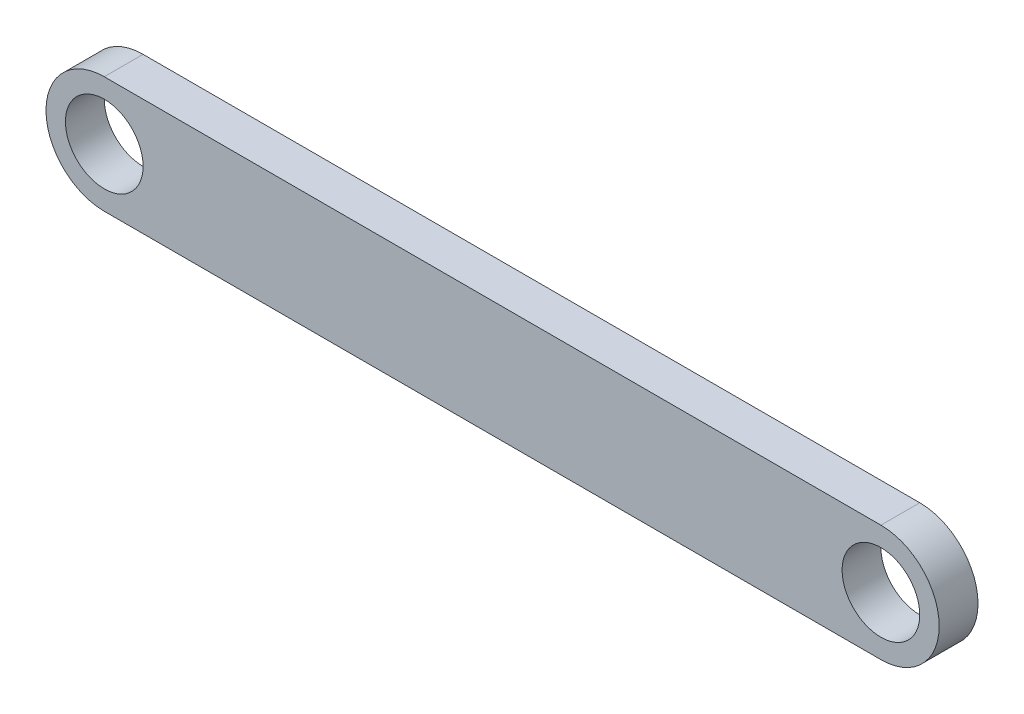
ISO-10303-21;
HEADER;
FILE_DESCRIPTION(('STEP AP214'),'2;1');
FILE_NAME('part.step','',(''),(''),'','','');
FILE_SCHEMA(('AUTOMOTIVE_DESIGN { 1 0 10303 214 1 1 1 1 }'));
ENDSEC;
DATA;
#1=APPLICATION_CONTEXT('core data for automotive mechanical design processes');
#2=APPLICATION_PROTOCOL_DEFINITION('international standard','automotive_design',2000,#1);
#3=PRODUCT_CONTEXT('',#1,'mechanical');
#4=PRODUCT('Part','Part','',(#3));
#5=PRODUCT_RELATED_PRODUCT_CATEGORY('part','',(#4));
#6=PRODUCT_DEFINITION_FORMATION('','',#4);
#7=PRODUCT_DEFINITION_CONTEXT('part definition',#1,'design');
#8=PRODUCT_DEFINITION('design','',#6,#7);
#9=PRODUCT_DEFINITION_SHAPE('','',#8);
#10=(LENGTH_UNIT() NAMED_UNIT(*) SI_UNIT(.MILLI.,.METRE.));
#11=(NAMED_UNIT(*) PLANE_ANGLE_UNIT() SI_UNIT($,.RADIAN.));
#12=(NAMED_UNIT(*) SI_UNIT($,.STERADIAN.) SOLID_ANGLE_UNIT());
#13=UNCERTAINTY_MEASURE_WITH_UNIT(LENGTH_MEASURE(1.E-05),#10,'distance_accuracy_value','');
#14=(GEOMETRIC_REPRESENTATION_CONTEXT(3) GLOBAL_UNCERTAINTY_ASSIGNED_CONTEXT((#13)) GLOBAL_UNIT_ASSIGNED_CONTEXT((#10,
#11,#12)) REPRESENTATION_CONTEXT('',''));
#15=CARTESIAN_POINT('',(0.,0.,0.));
#16=DIRECTION('',(0.,0.,1.));
#17=DIRECTION('',(1.,0.,0.));
#18=AXIS2_PLACEMENT_3D('',#15,#16,#17);
#19=CARTESIAN_POINT('',(100.,-30.,10.));
#20=DIRECTION('',(0.,1.,0.));
#21=DIRECTION('',(-1.,0.,0.));
#22=AXIS2_PLACEMENT_3D('',#19,#20,#21);
#23=PLANE('',#22);
#24=DIRECTION('',(1.,0.,0.));
#25=VECTOR('',#24,1.);
#26=CARTESIAN_POINT('',(100.,-30.,0.));
#27=LINE('',#26,#25);
#28=CARTESIAN_POINT('',(-100.,-30.,0.));
#29=VERTEX_POINT('',#28);
#30=CARTESIAN_POINT('',(100.,-30.,0.));
#31=VERTEX_POINT('',#30);
#32=EDGE_CURVE('E68',#29,#31,#27,.T.);
#33=ORIENTED_EDGE('',*,*,#32,.T.);
#34=DIRECTION('',(0.,0.,-1.));
#35=VECTOR('',#34,1.);
#36=CARTESIAN_POINT('',(100.,-30.,10.));
#37=LINE('',#36,#35);
#38=CARTESIAN_POINT('',(100.,-30.,10.));
#39=VERTEX_POINT('',#38);
#40=EDGE_CURVE('E49',#39,#31,#37,.T.);
#41=ORIENTED_EDGE('',*,*,#40,.F.);
#42=DIRECTION('',(1.,0.,0.));
#43=VECTOR('',#42,1.);
#44=CARTESIAN_POINT('',(100.,-30.,10.));
#45=LINE('',#44,#43);
#46=CARTESIAN_POINT('',(-100.,-30.,10.));
#47=VERTEX_POINT('',#46);
#48=EDGE_CURVE('E80',#47,#39,#45,.T.);
#49=ORIENTED_EDGE('',*,*,#48,.F.);
#50=DIRECTION('',(0.,0.,-1.));
#51=VECTOR('',#50,1.);
#52=CARTESIAN_POINT('',(-100.,-30.,10.));
#53=LINE('',#52,#51);
#54=EDGE_CURVE('E11',#47,#29,#53,.T.);
#55=ORIENTED_EDGE('',*,*,#54,.T.);
#56=EDGE_LOOP('',(#33,#41,#49,#55));
#57=FACE_BOUND('',#56,.T.);
#58=ADVANCED_FACE('F41',(#57),#23,.F.);
#59=CARTESIAN_POINT('',(-100.,0.,10.));
#60=DIRECTION('',(0.,-1.,0.));
#61=DIRECTION('',(1.,0.,0.));
#62=AXIS2_PLACEMENT_3D('',#59,#60,#61);
#63=PLANE('',#62);
#64=DIRECTION('',(-1.,0.,0.));
#65=VECTOR('',#64,1.);
#66=CARTESIAN_POINT('',(-100.,0.,0.));
#67=LINE('',#66,#65);
#68=CARTESIAN_POINT('',(100.,0.,0.));
#69=VERTEX_POINT('',#68);
#70=CARTESIAN_POINT('',(-100.,0.,0.));
#71=VERTEX_POINT('',#70);
#72=EDGE_CURVE('E86',#69,#71,#67,.T.);
#73=ORIENTED_EDGE('',*,*,#72,.T.);
#74=DIRECTION('',(0.,0.,-1.));
#75=VECTOR('',#74,1.);
#76=CARTESIAN_POINT('',(-100.,0.,10.));
#77=LINE('',#76,#75);
#78=CARTESIAN_POINT('',(-100.,0.,10.));
#79=VERTEX_POINT('',#78);
#80=EDGE_CURVE('E104',#79,#71,#77,.T.);
#81=ORIENTED_EDGE('',*,*,#80,.F.);
#82=DIRECTION('',(-1.,0.,0.));
#83=VECTOR('',#82,1.);
#84=CARTESIAN_POINT('',(-100.,0.,10.));
#85=LINE('',#84,#83);
#86=CARTESIAN_POINT('',(100.,0.,10.));
#87=VERTEX_POINT('',#86);
#88=EDGE_CURVE('E57',#87,#79,#85,.T.);
#89=ORIENTED_EDGE('',*,*,#88,.F.);
#90=DIRECTION('',(0.,0.,-1.));
#91=VECTOR('',#90,1.);
#92=CARTESIAN_POINT('',(100.,0.,10.));
#93=LINE('',#92,#91);
#94=EDGE_CURVE('E91',#87,#69,#93,.T.);
#95=ORIENTED_EDGE('',*,*,#94,.T.);
#96=EDGE_LOOP('',(#73,#81,#89,#95));
#97=FACE_BOUND('',#96,.T.);
#98=ADVANCED_FACE('F110',(#97),#63,.F.);
#99=CARTESIAN_POINT('',(0.,0.,10.));
#100=DIRECTION('',(0.,0.,-1.));
#101=DIRECTION('',(-1.,0.,0.));
#102=AXIS2_PLACEMENT_3D('',#99,#100,#101);
#103=PLANE('',#102);
#104=CARTESIAN_POINT('',(-100.,-15.,10.));
#105=DIRECTION('',(0.,0.,1.));
#106=DIRECTION('',(1.,0.,0.));
#107=AXIS2_PLACEMENT_3D('',#104,#105,#106);
#108=CIRCLE('',#107,9.99999999999999);
#109=CARTESIAN_POINT('',(-90.0000000000001,-15.,10.));
#110=VERTEX_POINT('',#109);
#111=EDGE_CURVE('E123',#110,#110,#108,.T.);
#112=ORIENTED_EDGE('',*,*,#111,.F.);
#113=EDGE_LOOP('',(#112));
#114=FACE_BOUND('',#113,.T.);
#115=CARTESIAN_POINT('',(100.,-15.,10.));
#116=DIRECTION('',(0.,0.,1.));
#117=DIRECTION('',(-1.,0.,0.));
#118=AXIS2_PLACEMENT_3D('',#115,#116,#117);
#119=CIRCLE('',#118,9.99999999999999);
#120=CARTESIAN_POINT('',(90.0000000000001,-15.,10.));
#121=VERTEX_POINT('',#120);
#122=EDGE_CURVE('E120',#121,#121,#119,.T.);
#123=ORIENTED_EDGE('',*,*,#122,.F.);
#124=EDGE_LOOP('',(#123));
#125=FACE_BOUND('',#124,.T.);
#126=ORIENTED_EDGE('',*,*,#88,.T.);
#127=CARTESIAN_POINT('',(-100.,-15.,10.));
#128=DIRECTION('',(0.,0.,1.));
#129=DIRECTION('',(1.,0.,0.));
#130=AXIS2_PLACEMENT_3D('',#127,#128,#129);
#131=CIRCLE('',#130,15.);
#132=EDGE_CURVE('E85',#79,#47,#131,.T.);
#133=ORIENTED_EDGE('',*,*,#132,.T.);
#134=ORIENTED_EDGE('',*,*,#48,.T.);
#135=CARTESIAN_POINT('',(100.,-15.,10.));
#136=DIRECTION('',(0.,0.,1.));
#137=DIRECTION('',(1.,0.,0.));
#138=AXIS2_PLACEMENT_3D('',#135,#136,#137);
#139=CIRCLE('',#138,15.);
#140=EDGE_CURVE('E83',#39,#87,#139,.T.);
#141=ORIENTED_EDGE('',*,*,#140,.T.);
#142=EDGE_LOOP('',(#126,#133,#134,#141));
#143=FACE_BOUND('',#142,.T.);
#144=ADVANCED_FACE('F81',(#114,#125,#143),#103,.F.);
#145=CARTESIAN_POINT('',(0.,0.,0.));
#146=DIRECTION('',(0.,0.,-1.));
#147=DIRECTION('',(-1.,0.,0.));
#148=AXIS2_PLACEMENT_3D('',#145,#146,#147);
#149=PLANE('',#148);
#150=CARTESIAN_POINT('',(-100.,-15.,0.));
#151=DIRECTION('',(0.,0.,1.));
#152=DIRECTION('',(1.,0.,0.));
#153=AXIS2_PLACEMENT_3D('',#150,#151,#152);
#154=CIRCLE('',#153,9.99999999999999);
#155=CARTESIAN_POINT('',(-90.0000000000001,-15.,0.));
#156=VERTEX_POINT('',#155);
#157=EDGE_CURVE('E99',#156,#156,#154,.T.);
#158=ORIENTED_EDGE('',*,*,#157,.T.);
#159=EDGE_LOOP('',(#158));
#160=FACE_BOUND('',#159,.T.);
#161=CARTESIAN_POINT('',(100.,-15.,0.));
#162=DIRECTION('',(0.,0.,1.));
#163=DIRECTION('',(-1.,0.,0.));
#164=AXIS2_PLACEMENT_3D('',#161,#162,#163);
#165=CIRCLE('',#164,9.99999999999999);
#166=CARTESIAN_POINT('',(90.0000000000001,-15.,0.));
#167=VERTEX_POINT('',#166);
#168=EDGE_CURVE('E117',#167,#167,#165,.T.);
#169=ORIENTED_EDGE('',*,*,#168,.T.);
#170=EDGE_LOOP('',(#169));
#171=FACE_BOUND('',#170,.T.);
#172=ORIENTED_EDGE('',*,*,#32,.F.);
#173=CARTESIAN_POINT('',(-100.,-15.,0.));
#174=DIRECTION('',(0.,0.,1.));
#175=DIRECTION('',(1.,0.,0.));
#176=AXIS2_PLACEMENT_3D('',#173,#174,#175);
#177=CIRCLE('',#176,15.);
#178=EDGE_CURVE('E97',#71,#29,#177,.T.);
#179=ORIENTED_EDGE('',*,*,#178,.F.);
#180=ORIENTED_EDGE('',*,*,#72,.F.);
#181=CARTESIAN_POINT('',(100.,-15.,0.));
#182=DIRECTION('',(0.,0.,1.));
#183=DIRECTION('',(1.,0.,0.));
#184=AXIS2_PLACEMENT_3D('',#181,#182,#183);
#185=CIRCLE('',#184,15.);
#186=EDGE_CURVE('E95',#31,#69,#185,.T.);
#187=ORIENTED_EDGE('',*,*,#186,.F.);
#188=EDGE_LOOP('',(#172,#179,#180,#187));
#189=FACE_BOUND('',#188,.T.);
#190=ADVANCED_FACE('F112',(#160,#171,#189),#149,.T.);
#191=CARTESIAN_POINT('',(100.,-15.,0.));
#192=DIRECTION('',(0.,0.,1.));
#193=DIRECTION('',(1.,0.,0.));
#194=AXIS2_PLACEMENT_3D('',#191,#192,#193);
#195=CYLINDRICAL_SURFACE('',#194,15.);
#196=ORIENTED_EDGE('',*,*,#140,.F.);
#197=ORIENTED_EDGE('',*,*,#40,.T.);
#198=ORIENTED_EDGE('',*,*,#186,.T.);
#199=ORIENTED_EDGE('',*,*,#94,.F.);
#200=EDGE_LOOP('',(#196,#197,#198,#199));
#201=FACE_BOUND('',#200,.T.);
#202=ADVANCED_FACE('F93',(#201),#195,.T.);
#203=CARTESIAN_POINT('',(-100.,-15.,0.));
#204=DIRECTION('',(0.,0.,1.));
#205=DIRECTION('',(1.,0.,0.));
#206=AXIS2_PLACEMENT_3D('',#203,#204,#205);
#207=CYLINDRICAL_SURFACE('',#206,15.);
#208=ORIENTED_EDGE('',*,*,#132,.F.);
#209=ORIENTED_EDGE('',*,*,#80,.T.);
#210=ORIENTED_EDGE('',*,*,#178,.T.);
#211=ORIENTED_EDGE('',*,*,#54,.F.);
#212=EDGE_LOOP('',(#208,#209,#210,#211));
#213=FACE_BOUND('',#212,.T.);
#214=ADVANCED_FACE('F144',(#213),#207,.T.);
#215=CARTESIAN_POINT('',(100.,-15.,0.));
#216=DIRECTION('',(0.,0.,1.));
#217=DIRECTION('',(1.,0.,0.));
#218=AXIS2_PLACEMENT_3D('',#215,#216,#217);
#219=CYLINDRICAL_SURFACE('',#218,9.99999999999999);
#220=ORIENTED_EDGE('',*,*,#168,.F.);
#221=EDGE_LOOP('',(#220));
#222=FACE_BOUND('',#221,.T.);
#223=ORIENTED_EDGE('',*,*,#122,.T.);
#224=EDGE_LOOP('',(#223));
#225=FACE_BOUND('',#224,.T.);
#226=ADVANCED_FACE('F134',(#222,#225),#219,.F.);
#227=CARTESIAN_POINT('',(-100.,-15.,0.));
#228=DIRECTION('',(0.,0.,1.));
#229=DIRECTION('',(1.,0.,0.));
#230=AXIS2_PLACEMENT_3D('',#227,#228,#229);
#231=CYLINDRICAL_SURFACE('',#230,9.99999999999999);
#232=ORIENTED_EDGE('',*,*,#157,.F.);
#233=EDGE_LOOP('',(#232));
#234=FACE_BOUND('',#233,.T.);
#235=ORIENTED_EDGE('',*,*,#111,.T.);
#236=EDGE_LOOP('',(#235));
#237=FACE_BOUND('',#236,.T.);
#238=ADVANCED_FACE('F131',(#234,#237),#231,.F.);
#239=CLOSED_SHELL('',(#58,#98,#144,#190,#202,#214,#226,#238));
#240=MANIFOLD_SOLID_BREP('B2',#239);
#241=ADVANCED_BREP_SHAPE_REPRESENTATION('',(#18,#240),#14);
#242=SHAPE_DEFINITION_REPRESENTATION(#9,#241);
ENDSEC;
END-ISO-10303-21;
